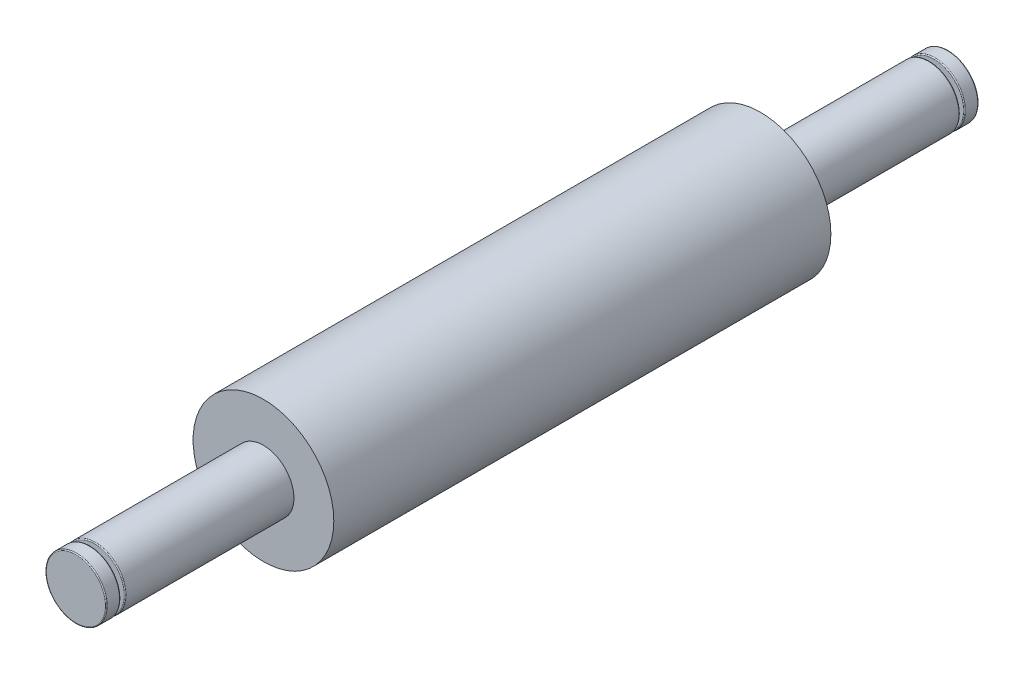
ISO-10303-21;
HEADER;
FILE_DESCRIPTION(('STEP AP214'),'2;1');
FILE_NAME('part.step','',(''),(''),'','','');
FILE_SCHEMA(('AUTOMOTIVE_DESIGN { 1 0 10303 214 1 1 1 1 }'));
ENDSEC;
DATA;
#1=APPLICATION_CONTEXT('core data for automotive mechanical design processes');
#2=APPLICATION_PROTOCOL_DEFINITION('international standard','automotive_design',2000,#1);
#3=PRODUCT_CONTEXT('',#1,'mechanical');
#4=PRODUCT('Part','Part','',(#3));
#5=PRODUCT_RELATED_PRODUCT_CATEGORY('part','',(#4));
#6=PRODUCT_DEFINITION_FORMATION('','',#4);
#7=PRODUCT_DEFINITION_CONTEXT('part definition',#1,'design');
#8=PRODUCT_DEFINITION('design','',#6,#7);
#9=PRODUCT_DEFINITION_SHAPE('','',#8);
#10=(LENGTH_UNIT() NAMED_UNIT(*) SI_UNIT(.MILLI.,.METRE.));
#11=(NAMED_UNIT(*) PLANE_ANGLE_UNIT() SI_UNIT($,.RADIAN.));
#12=(NAMED_UNIT(*) SI_UNIT($,.STERADIAN.) SOLID_ANGLE_UNIT());
#13=UNCERTAINTY_MEASURE_WITH_UNIT(LENGTH_MEASURE(1.E-05),#10,'distance_accuracy_value','');
#14=(GEOMETRIC_REPRESENTATION_CONTEXT(3) GLOBAL_UNCERTAINTY_ASSIGNED_CONTEXT((#13)) GLOBAL_UNIT_ASSIGNED_CONTEXT((#10,
#11,#12)) REPRESENTATION_CONTEXT('',''));
#15=CARTESIAN_POINT('',(0.,0.,0.));
#16=DIRECTION('',(0.,0.,1.));
#17=DIRECTION('',(1.,0.,0.));
#18=AXIS2_PLACEMENT_3D('',#15,#16,#17);
#19=CARTESIAN_POINT('',(378.123219940926,127.240995387737,-53.));
#20=DIRECTION('',(0.,0.,1.));
#21=DIRECTION('',(1.,0.,0.));
#22=AXIS2_PLACEMENT_3D('',#19,#20,#21);
#23=CYLINDRICAL_SURFACE('',#22,7.50000000000007);
#24=CARTESIAN_POINT('',(378.123219940926,127.240995387737,-53.));
#25=DIRECTION('',(0.,0.,1.));
#26=DIRECTION('',(1.,0.,0.));
#27=AXIS2_PLACEMENT_3D('',#24,#25,#26);
#28=CIRCLE('',#27,7.50000000000007);
#29=CARTESIAN_POINT('',(385.623219940926,127.240995387737,-53.));
#30=VERTEX_POINT('',#29);
#31=EDGE_CURVE('E88',#30,#30,#28,.T.);
#32=ORIENTED_EDGE('',*,*,#31,.T.);
#33=EDGE_LOOP('',(#32));
#34=FACE_BOUND('',#33,.T.);
#35=CARTESIAN_POINT('',(378.123219940926,127.240995387737,0.));
#36=DIRECTION('',(0.,0.,1.));
#37=DIRECTION('',(1.,0.,0.));
#38=AXIS2_PLACEMENT_3D('',#35,#36,#37);
#39=CIRCLE('',#38,7.50000000000007);
#40=CARTESIAN_POINT('',(385.623219940926,127.240995387737,0.));
#41=VERTEX_POINT('',#40);
#42=EDGE_CURVE('E89',#41,#41,#39,.T.);
#43=ORIENTED_EDGE('',*,*,#42,.F.);
#44=EDGE_LOOP('',(#43));
#45=FACE_BOUND('',#44,.T.);
#46=ADVANCED_FACE('F35',(#34,#45),#23,.T.);
#47=CARTESIAN_POINT('',(378.123219940926,127.240995387737,-53.));
#48=DIRECTION('',(0.,0.,1.));
#49=DIRECTION('',(1.,0.,0.));
#50=AXIS2_PLACEMENT_3D('',#47,#48,#49);
#51=PLANE('',#50);
#52=CARTESIAN_POINT('',(378.123219940926,127.240995387737,-53.));
#53=DIRECTION('',(0.,0.,1.));
#54=DIRECTION('',(1.,0.,0.));
#55=AXIS2_PLACEMENT_3D('',#52,#53,#54);
#56=CIRCLE('',#55,3.24999999999995);
#57=CARTESIAN_POINT('',(381.373219940926,127.240995387737,-53.));
#58=VERTEX_POINT('',#57);
#59=EDGE_CURVE('E83',#58,#58,#56,.T.);
#60=ORIENTED_EDGE('',*,*,#59,.T.);
#61=EDGE_LOOP('',(#60));
#62=FACE_BOUND('',#61,.T.);
#63=ORIENTED_EDGE('',*,*,#31,.F.);
#64=EDGE_LOOP('',(#63));
#65=FACE_BOUND('',#64,.T.);
#66=ADVANCED_FACE('F122',(#62,#65),#51,.F.);
#67=CARTESIAN_POINT('',(378.123219940926,127.240995387737,0.));
#68=DIRECTION('',(0.,0.,1.));
#69=DIRECTION('',(1.,0.,0.));
#70=AXIS2_PLACEMENT_3D('',#67,#68,#69);
#71=PLANE('',#70);
#72=CARTESIAN_POINT('',(378.123219940926,127.240995387737,0.));
#73=DIRECTION('',(0.,0.,1.));
#74=DIRECTION('',(1.,0.,0.));
#75=AXIS2_PLACEMENT_3D('',#72,#73,#74);
#76=CIRCLE('',#75,3.24999999999995);
#77=CARTESIAN_POINT('',(381.373219940926,127.240995387737,0.));
#78=VERTEX_POINT('',#77);
#79=EDGE_CURVE('E85',#78,#78,#76,.T.);
#80=ORIENTED_EDGE('',*,*,#79,.F.);
#81=EDGE_LOOP('',(#80));
#82=FACE_BOUND('',#81,.T.);
#83=ORIENTED_EDGE('',*,*,#42,.T.);
#84=EDGE_LOOP('',(#83));
#85=FACE_BOUND('',#84,.T.);
#86=ADVANCED_FACE('F128',(#82,#85),#71,.T.);
#87=CARTESIAN_POINT('',(378.123219940926,127.240995387737,18.));
#88=DIRECTION('',(0.,0.,1.));
#89=DIRECTION('',(1.,0.,0.));
#90=AXIS2_PLACEMENT_3D('',#87,#88,#89);
#91=PLANE('',#90);
#92=CARTESIAN_POINT('',(378.123219940926,127.240995387737,18.));
#93=DIRECTION('',(0.,0.,1.));
#94=DIRECTION('',(1.,0.,0.));
#95=AXIS2_PLACEMENT_3D('',#92,#93,#94);
#96=CIRCLE('',#95,3.14999999999996);
#97=CARTESIAN_POINT('',(381.273219940926,127.240995387737,18.));
#98=VERTEX_POINT('',#97);
#99=EDGE_CURVE('E70',#98,#98,#96,.T.);
#100=ORIENTED_EDGE('',*,*,#99,.T.);
#101=EDGE_LOOP('',(#100));
#102=FACE_BOUND('',#101,.T.);
#103=CARTESIAN_POINT('',(378.123219940926,127.240995387737,18.));
#104=DIRECTION('',(0.,0.,1.));
#105=DIRECTION('',(1.,0.,0.));
#106=AXIS2_PLACEMENT_3D('',#103,#104,#105);
#107=CIRCLE('',#106,1.74999999999998);
#108=CARTESIAN_POINT('',(379.873219940926,127.240995387737,18.));
#109=VERTEX_POINT('',#108);
#110=EDGE_CURVE('E79',#109,#109,#107,.T.);
#111=ORIENTED_EDGE('',*,*,#110,.F.);
#112=EDGE_LOOP('',(#111));
#113=FACE_BOUND('',#112,.T.);
#114=ADVANCED_FACE('F285',(#102,#113),#91,.T.);
#115=CARTESIAN_POINT('',(378.123219940926,127.240995387737,-71.));
#116=DIRECTION('',(0.,0.,1.));
#117=DIRECTION('',(1.,0.,0.));
#118=AXIS2_PLACEMENT_3D('',#115,#116,#117);
#119=CYLINDRICAL_SURFACE('',#118,3.24999999999995);
#120=CARTESIAN_POINT('',(378.123219940926,127.240995387737,17.9));
#121=DIRECTION('',(0.,0.,1.));
#122=DIRECTION('',(1.,0.,0.));
#123=AXIS2_PLACEMENT_3D('',#120,#121,#122);
#124=CIRCLE('',#123,3.24999999999995);
#125=CARTESIAN_POINT('',(381.373219940926,127.240995387737,17.9));
#126=VERTEX_POINT('',#125);
#127=EDGE_CURVE('E67',#126,#126,#124,.F.);
#128=ORIENTED_EDGE('',*,*,#127,.T.);
#129=EDGE_LOOP('',(#128));
#130=FACE_BOUND('',#129,.T.);
#131=ORIENTED_EDGE('',*,*,#79,.T.);
#132=EDGE_LOOP('',(#131));
#133=FACE_BOUND('',#132,.T.);
#134=ADVANCED_FACE('F276',(#130,#133),#119,.T.);
#135=CARTESIAN_POINT('',(378.123219940926,127.240995387737,-70.9));
#136=DIRECTION('',(0.,0.,1.));
#137=DIRECTION('',(1.,0.,0.));
#138=AXIS2_PLACEMENT_3D('',#135,#136,#137);
#139=CIRCLE('',#138,3.24999999999995);
#140=CARTESIAN_POINT('',(381.373219940926,127.240995387737,-70.9));
#141=VERTEX_POINT('',#140);
#142=EDGE_CURVE('E64',#141,#141,#139,.T.);
#143=ORIENTED_EDGE('',*,*,#142,.T.);
#144=EDGE_LOOP('',(#143));
#145=FACE_BOUND('',#144,.T.);
#146=ORIENTED_EDGE('',*,*,#59,.F.);
#147=EDGE_LOOP('',(#146));
#148=FACE_BOUND('',#147,.T.);
#149=ADVANCED_FACE('F267',(#145,#148),#119,.T.);
#150=CARTESIAN_POINT('',(378.123219940926,127.240995387737,-71.));
#151=DIRECTION('',(0.,0.,1.));
#152=DIRECTION('',(1.,0.,0.));
#153=AXIS2_PLACEMENT_3D('',#150,#151,#152);
#154=PLANE('',#153);
#155=CARTESIAN_POINT('',(378.123219940926,127.240995387737,-71.));
#156=DIRECTION('',(0.,0.,1.));
#157=DIRECTION('',(1.,0.,0.));
#158=AXIS2_PLACEMENT_3D('',#155,#156,#157);
#159=CIRCLE('',#158,3.14999999999996);
#160=CARTESIAN_POINT('',(381.273219940926,127.240995387737,-71.));
#161=VERTEX_POINT('',#160);
#162=EDGE_CURVE('E61',#161,#161,#159,.F.);
#163=ORIENTED_EDGE('',*,*,#162,.T.);
#164=EDGE_LOOP('',(#163));
#165=FACE_BOUND('',#164,.T.);
#166=CARTESIAN_POINT('',(378.123219940926,127.240995387737,-71.));
#167=DIRECTION('',(0.,0.,1.));
#168=DIRECTION('',(1.,0.,0.));
#169=AXIS2_PLACEMENT_3D('',#166,#167,#168);
#170=CIRCLE('',#169,1.74999999999998);
#171=CARTESIAN_POINT('',(379.873219940926,127.240995387737,-71.));
#172=VERTEX_POINT('',#171);
#173=EDGE_CURVE('E80',#172,#172,#170,.T.);
#174=ORIENTED_EDGE('',*,*,#173,.T.);
#175=EDGE_LOOP('',(#174));
#176=FACE_BOUND('',#175,.T.);
#177=ADVANCED_FACE('F118',(#165,#176),#154,.F.);
#178=CARTESIAN_POINT('',(378.123219940926,127.240995387737,-71.5));
#179=DIRECTION('',(0.,0.,1.));
#180=DIRECTION('',(1.,0.,0.));
#181=AXIS2_PLACEMENT_3D('',#178,#179,#180);
#182=CYLINDRICAL_SURFACE('',#181,1.74999999999998);
#183=CARTESIAN_POINT('',(378.123219940926,127.240995387737,-71.5));
#184=DIRECTION('',(0.,0.,1.));
#185=DIRECTION('',(1.,0.,0.));
#186=AXIS2_PLACEMENT_3D('',#183,#184,#185);
#187=CIRCLE('',#186,1.74999999999998);
#188=CARTESIAN_POINT('',(379.873219940926,127.240995387737,-71.5));
#189=VERTEX_POINT('',#188);
#190=EDGE_CURVE('E98',#189,#189,#187,.T.);
#191=CARTESIAN_POINT('',(379.873219940926,127.240995387737,-71.5));
#192=CARTESIAN_POINT('',(379.873219940926,127.240995387737,-71.4947916666667));
#193=CARTESIAN_POINT('',(379.873219940926,127.240995387737,-71.4895833333333));
#194=CARTESIAN_POINT('',(379.873219940926,127.240995387737,-71.4791666666667));
#195=CARTESIAN_POINT('',(379.873219940926,127.240995387737,-71.4739583333333));
#196=CARTESIAN_POINT('',(379.873219940926,127.240995387737,-71.4635416666667));
#197=CARTESIAN_POINT('',(379.873219940926,127.240995387737,-71.4583333333333));
#198=CARTESIAN_POINT('',(379.873219940926,127.240995387737,-71.4479166666667));
#199=CARTESIAN_POINT('',(379.873219940926,127.240995387737,-71.4427083333333));
#200=CARTESIAN_POINT('',(379.873219940926,127.240995387737,-71.4322916666667));
#201=CARTESIAN_POINT('',(379.873219940926,127.240995387737,-71.4270833333333));
#202=CARTESIAN_POINT('',(379.873219940926,127.240995387737,-71.4166666666667));
#203=CARTESIAN_POINT('',(379.873219940926,127.240995387737,-71.4114583333333));
#204=CARTESIAN_POINT('',(379.873219940926,127.240995387737,-71.4010416666667));
#205=CARTESIAN_POINT('',(379.873219940926,127.240995387737,-71.3958333333333));
#206=CARTESIAN_POINT('',(379.873219940926,127.240995387737,-71.3854166666667));
#207=CARTESIAN_POINT('',(379.873219940926,127.240995387737,-71.3802083333333));
#208=CARTESIAN_POINT('',(379.873219940926,127.240995387737,-71.3697916666667));
#209=CARTESIAN_POINT('',(379.873219940926,127.240995387737,-71.3645833333333));
#210=CARTESIAN_POINT('',(379.873219940926,127.240995387737,-71.3541666666667));
#211=CARTESIAN_POINT('',(379.873219940926,127.240995387737,-71.3489583333333));
#212=CARTESIAN_POINT('',(379.873219940926,127.240995387737,-71.3385416666667));
#213=CARTESIAN_POINT('',(379.873219940926,127.240995387737,-71.3333333333333));
#214=CARTESIAN_POINT('',(379.873219940926,127.240995387737,-71.3229166666667));
#215=CARTESIAN_POINT('',(379.873219940926,127.240995387737,-71.3177083333333));
#216=CARTESIAN_POINT('',(379.873219940926,127.240995387737,-71.3072916666667));
#217=CARTESIAN_POINT('',(379.873219940926,127.240995387737,-71.3020833333333));
#218=CARTESIAN_POINT('',(379.873219940926,127.240995387737,-71.2916666666667));
#219=CARTESIAN_POINT('',(379.873219940926,127.240995387737,-71.2864583333333));
#220=CARTESIAN_POINT('',(379.873219940926,127.240995387737,-71.2760416666667));
#221=CARTESIAN_POINT('',(379.873219940926,127.240995387737,-71.2708333333333));
#222=CARTESIAN_POINT('',(379.873219940926,127.240995387737,-71.2604166666667));
#223=CARTESIAN_POINT('',(379.873219940926,127.240995387737,-71.2552083333333));
#224=CARTESIAN_POINT('',(379.873219940926,127.240995387737,-71.2447916666667));
#225=CARTESIAN_POINT('',(379.873219940926,127.240995387737,-71.2395833333333));
#226=CARTESIAN_POINT('',(379.873219940926,127.240995387737,-71.2291666666667));
#227=CARTESIAN_POINT('',(379.873219940926,127.240995387737,-71.2239583333333));
#228=CARTESIAN_POINT('',(379.873219940926,127.240995387737,-71.2135416666667));
#229=CARTESIAN_POINT('',(379.873219940926,127.240995387737,-71.2083333333333));
#230=CARTESIAN_POINT('',(379.873219940926,127.240995387737,-71.1979166666667));
#231=CARTESIAN_POINT('',(379.873219940926,127.240995387737,-71.1927083333333));
#232=CARTESIAN_POINT('',(379.873219940926,127.240995387737,-71.1822916666667));
#233=CARTESIAN_POINT('',(379.873219940926,127.240995387737,-71.1770833333333));
#234=CARTESIAN_POINT('',(379.873219940926,127.240995387737,-71.1666666666667));
#235=CARTESIAN_POINT('',(379.873219940926,127.240995387737,-71.1614583333333));
#236=CARTESIAN_POINT('',(379.873219940926,127.240995387737,-71.1510416666667));
#237=CARTESIAN_POINT('',(379.873219940926,127.240995387737,-71.1458333333333));
#238=CARTESIAN_POINT('',(379.873219940926,127.240995387737,-71.1354166666667));
#239=CARTESIAN_POINT('',(379.873219940926,127.240995387737,-71.1302083333333));
#240=CARTESIAN_POINT('',(379.873219940926,127.240995387737,-71.1197916666667));
#241=CARTESIAN_POINT('',(379.873219940926,127.240995387737,-71.1145833333333));
#242=CARTESIAN_POINT('',(379.873219940926,127.240995387737,-71.1041666666667));
#243=CARTESIAN_POINT('',(379.873219940926,127.240995387737,-71.0989583333333));
#244=CARTESIAN_POINT('',(379.873219940926,127.240995387737,-71.0885416666667));
#245=CARTESIAN_POINT('',(379.873219940926,127.240995387737,-71.0833333333333));
#246=CARTESIAN_POINT('',(379.873219940926,127.240995387737,-71.0729166666667));
#247=CARTESIAN_POINT('',(379.873219940926,127.240995387737,-71.0677083333333));
#248=CARTESIAN_POINT('',(379.873219940926,127.240995387737,-71.0572916666667));
#249=CARTESIAN_POINT('',(379.873219940926,127.240995387737,-71.0520833333333));
#250=CARTESIAN_POINT('',(379.873219940926,127.240995387737,-71.0416666666667));
#251=CARTESIAN_POINT('',(379.873219940926,127.240995387737,-71.0364583333333));
#252=CARTESIAN_POINT('',(379.873219940926,127.240995387737,-71.0260416666667));
#253=CARTESIAN_POINT('',(379.873219940926,127.240995387737,-71.0208333333333));
#254=CARTESIAN_POINT('',(379.873219940926,127.240995387737,-71.0104166666667));
#255=CARTESIAN_POINT('',(379.873219940926,127.240995387737,-71.0052083333333));
#256=CARTESIAN_POINT('',(379.873219940926,127.240995387737,-71.));
#257=B_SPLINE_CURVE_WITH_KNOTS('',3,(#191,#192,#193,#194,#195,#196,#197,#198,#199,#200,#201,
#202,#203,#204,#205,#206,#207,#208,#209,#210,#211,#212,#213,#214,#215,#216,#217,#218,#219,#220,
#221,#222,#223,#224,#225,#226,#227,#228,#229,#230,#231,#232,#233,#234,#235,#236,#237,#238,#239,
#240,#241,#242,#243,#244,#245,#246,#247,#248,#249,#250,#251,#252,#253,#254,#255,#256),
.UNSPECIFIED.,.F.,.F.,(4,2,2,2,2,2,2,2,2,2,2,2,2,2,2,2,2,2,2,2,2,2,2,2,2,2,2,2,2,2,2,2,4),(0.,
0.0156250000000052,0.0312500000000104,0.0468750000000018,0.062500000000007,0.0781250000000122,
0.0937500000000036,0.109375000000009,0.125000000000014,0.140625000000005,0.156250000000011,
0.171875000000002,0.187500000000007,0.203125000000012,0.218750000000004,0.234375000000009,
0.250000000000014,0.265625000000005,0.281250000000011,0.296875000000002,0.312500000000007,
0.328125000000012,0.343750000000004,0.359375000000009,0.375000000000014,0.390625000000006,
0.406250000000011,0.421875000000002,0.437500000000007,0.453125000000013,0.468750000000004,
0.484375000000009,0.500000000000014),.UNSPECIFIED.);
#258=EDGE_CURVE('BSEAM109',#189,#172,#257,.T.);
#259=ORIENTED_EDGE('',*,*,#190,.T.);
#260=ORIENTED_EDGE('',*,*,#173,.F.);
#261=ORIENTED_EDGE('',*,*,#258,.T.);
#262=ORIENTED_EDGE('',*,*,#258,.F.);
#263=EDGE_LOOP('',(#259,#261,#260,#262));
#264=FACE_BOUND('',#263,.T.);
#265=ADVANCED_FACE('F109',(#264),#182,.T.);
#266=CARTESIAN_POINT('',(378.123219940926,127.240995387737,18.5));
#267=DIRECTION('',(0.,0.,1.));
#268=DIRECTION('',(1.,0.,0.));
#269=AXIS2_PLACEMENT_3D('',#266,#267,#268);
#270=CIRCLE('',#269,1.74999999999998);
#271=CARTESIAN_POINT('',(379.873219940926,127.240995387737,18.5));
#272=VERTEX_POINT('',#271);
#273=EDGE_CURVE('E84',#272,#272,#270,.T.);
#274=CARTESIAN_POINT('',(379.873219940926,127.240995387737,18.));
#275=CARTESIAN_POINT('',(379.873219940926,127.240995387737,18.0052083333333));
#276=CARTESIAN_POINT('',(379.873219940926,127.240995387737,18.0104166666667));
#277=CARTESIAN_POINT('',(379.873219940926,127.240995387737,18.0208333333333));
#278=CARTESIAN_POINT('',(379.873219940926,127.240995387737,18.0260416666667));
#279=CARTESIAN_POINT('',(379.873219940926,127.240995387737,18.0364583333333));
#280=CARTESIAN_POINT('',(379.873219940926,127.240995387737,18.0416666666667));
#281=CARTESIAN_POINT('',(379.873219940926,127.240995387737,18.0520833333333));
#282=CARTESIAN_POINT('',(379.873219940926,127.240995387737,18.0572916666667));
#283=CARTESIAN_POINT('',(379.873219940926,127.240995387737,18.0677083333333));
#284=CARTESIAN_POINT('',(379.873219940926,127.240995387737,18.0729166666667));
#285=CARTESIAN_POINT('',(379.873219940926,127.240995387737,18.0833333333333));
#286=CARTESIAN_POINT('',(379.873219940926,127.240995387737,18.0885416666667));
#287=CARTESIAN_POINT('',(379.873219940926,127.240995387737,18.0989583333333));
#288=CARTESIAN_POINT('',(379.873219940926,127.240995387737,18.1041666666667));
#289=CARTESIAN_POINT('',(379.873219940926,127.240995387737,18.1145833333333));
#290=CARTESIAN_POINT('',(379.873219940926,127.240995387737,18.1197916666667));
#291=CARTESIAN_POINT('',(379.873219940926,127.240995387737,18.1302083333333));
#292=CARTESIAN_POINT('',(379.873219940926,127.240995387737,18.1354166666667));
#293=CARTESIAN_POINT('',(379.873219940926,127.240995387737,18.1458333333333));
#294=CARTESIAN_POINT('',(379.873219940926,127.240995387737,18.1510416666667));
#295=CARTESIAN_POINT('',(379.873219940926,127.240995387737,18.1614583333333));
#296=CARTESIAN_POINT('',(379.873219940926,127.240995387737,18.1666666666667));
#297=CARTESIAN_POINT('',(379.873219940926,127.240995387737,18.1770833333333));
#298=CARTESIAN_POINT('',(379.873219940926,127.240995387737,18.1822916666667));
#299=CARTESIAN_POINT('',(379.873219940926,127.240995387737,18.1927083333333));
#300=CARTESIAN_POINT('',(379.873219940926,127.240995387737,18.1979166666667));
#301=CARTESIAN_POINT('',(379.873219940926,127.240995387737,18.2083333333333));
#302=CARTESIAN_POINT('',(379.873219940926,127.240995387737,18.2135416666667));
#303=CARTESIAN_POINT('',(379.873219940926,127.240995387737,18.2239583333333));
#304=CARTESIAN_POINT('',(379.873219940926,127.240995387737,18.2291666666667));
#305=CARTESIAN_POINT('',(379.873219940926,127.240995387737,18.2395833333333));
#306=CARTESIAN_POINT('',(379.873219940926,127.240995387737,18.2447916666667));
#307=CARTESIAN_POINT('',(379.873219940926,127.240995387737,18.2552083333333));
#308=CARTESIAN_POINT('',(379.873219940926,127.240995387737,18.2604166666667));
#309=CARTESIAN_POINT('',(379.873219940926,127.240995387737,18.2708333333333));
#310=CARTESIAN_POINT('',(379.873219940926,127.240995387737,18.2760416666667));
#311=CARTESIAN_POINT('',(379.873219940926,127.240995387737,18.2864583333333));
#312=CARTESIAN_POINT('',(379.873219940926,127.240995387737,18.2916666666667));
#313=CARTESIAN_POINT('',(379.873219940926,127.240995387737,18.3020833333333));
#314=CARTESIAN_POINT('',(379.873219940926,127.240995387737,18.3072916666667));
#315=CARTESIAN_POINT('',(379.873219940926,127.240995387737,18.3177083333333));
#316=CARTESIAN_POINT('',(379.873219940926,127.240995387737,18.3229166666667));
#317=CARTESIAN_POINT('',(379.873219940926,127.240995387737,18.3333333333333));
#318=CARTESIAN_POINT('',(379.873219940926,127.240995387737,18.3385416666667));
#319=CARTESIAN_POINT('',(379.873219940926,127.240995387737,18.3489583333333));
#320=CARTESIAN_POINT('',(379.873219940926,127.240995387737,18.3541666666667));
#321=CARTESIAN_POINT('',(379.873219940926,127.240995387737,18.3645833333333));
#322=CARTESIAN_POINT('',(379.873219940926,127.240995387737,18.3697916666667));
#323=CARTESIAN_POINT('',(379.873219940926,127.240995387737,18.3802083333333));
#324=CARTESIAN_POINT('',(379.873219940926,127.240995387737,18.3854166666667));
#325=CARTESIAN_POINT('',(379.873219940926,127.240995387737,18.3958333333333));
#326=CARTESIAN_POINT('',(379.873219940926,127.240995387737,18.4010416666667));
#327=CARTESIAN_POINT('',(379.873219940926,127.240995387737,18.4114583333333));
#328=CARTESIAN_POINT('',(379.873219940926,127.240995387737,18.4166666666667));
#329=CARTESIAN_POINT('',(379.873219940926,127.240995387737,18.4270833333333));
#330=CARTESIAN_POINT('',(379.873219940926,127.240995387737,18.4322916666667));
#331=CARTESIAN_POINT('',(379.873219940926,127.240995387737,18.4427083333333));
#332=CARTESIAN_POINT('',(379.873219940926,127.240995387737,18.4479166666667));
#333=CARTESIAN_POINT('',(379.873219940926,127.240995387737,18.4583333333333));
#334=CARTESIAN_POINT('',(379.873219940926,127.240995387737,18.4635416666667));
#335=CARTESIAN_POINT('',(379.873219940926,127.240995387737,18.4739583333333));
#336=CARTESIAN_POINT('',(379.873219940926,127.240995387737,18.4791666666667));
#337=CARTESIAN_POINT('',(379.873219940926,127.240995387737,18.4895833333333));
#338=CARTESIAN_POINT('',(379.873219940926,127.240995387737,18.4947916666667));
#339=CARTESIAN_POINT('',(379.873219940926,127.240995387737,18.5));
#340=B_SPLINE_CURVE_WITH_KNOTS('',3,(#274,#275,#276,#277,#278,#279,#280,#281,#282,#283,#284,
#285,#286,#287,#288,#289,#290,#291,#292,#293,#294,#295,#296,#297,#298,#299,#300,#301,#302,#303,
#304,#305,#306,#307,#308,#309,#310,#311,#312,#313,#314,#315,#316,#317,#318,#319,#320,#321,#322,
#323,#324,#325,#326,#327,#328,#329,#330,#331,#332,#333,#334,#335,#336,#337,#338,#339),
.UNSPECIFIED.,.F.,.F.,(4,2,2,2,2,2,2,2,2,2,2,2,2,2,2,2,2,2,2,2,2,2,2,2,2,2,2,2,2,2,2,2,4),(0.,
0.0156250000000052,0.0312499999999966,0.0468750000000018,0.0624999999999931,0.0781249999999983,
0.0937500000000036,0.109374999999995,0.125,0.140625000000005,0.156249999999997,
0.171875000000002,0.187500000000007,0.203124999999998,0.218750000000004,0.234374999999995,0.25,
0.265625000000005,0.281249999999997,0.296875000000002,0.312499999999993,0.328124999999999,
0.343750000000004,0.359374999999995,0.375,0.390625000000006,0.406249999999997,0.421875000000002,
0.437500000000007,0.453124999999999,0.468750000000004,0.484374999999995,0.5),.UNSPECIFIED.);
#341=EDGE_CURVE('BSEAM106',#109,#272,#340,.T.);
#342=ORIENTED_EDGE('',*,*,#110,.T.);
#343=ORIENTED_EDGE('',*,*,#273,.F.);
#344=ORIENTED_EDGE('',*,*,#341,.T.);
#345=ORIENTED_EDGE('',*,*,#341,.F.);
#346=EDGE_LOOP('',(#342,#344,#343,#345));
#347=FACE_BOUND('',#346,.T.);
#348=ADVANCED_FACE('F106',(#347),#182,.T.);
#349=CARTESIAN_POINT('',(378.123219940926,127.240995387737,20.));
#350=DIRECTION('',(0.,0.,-1.));
#351=DIRECTION('',(-1.,0.,0.));
#352=AXIS2_PLACEMENT_3D('',#349,#350,#351);
#353=CYLINDRICAL_SURFACE('',#352,3.24999999999995);
#354=CARTESIAN_POINT('',(378.123219940926,127.240995387737,19.9));
#355=DIRECTION('',(0.,0.,1.));
#356=DIRECTION('',(1.,0.,0.));
#357=AXIS2_PLACEMENT_3D('',#354,#355,#356);
#358=CIRCLE('',#357,3.24999999999995);
#359=CARTESIAN_POINT('',(381.373219940926,127.240995387737,19.9));
#360=VERTEX_POINT('',#359);
#361=EDGE_CURVE('E10',#360,#360,#358,.F.);
#362=ORIENTED_EDGE('',*,*,#361,.T.);
#363=EDGE_LOOP('',(#362));
#364=FACE_BOUND('',#363,.T.);
#365=CARTESIAN_POINT('',(378.123219940926,127.240995387737,18.6));
#366=DIRECTION('',(0.,0.,1.));
#367=DIRECTION('',(1.,0.,0.));
#368=AXIS2_PLACEMENT_3D('',#365,#366,#367);
#369=CIRCLE('',#368,3.24999999999995);
#370=CARTESIAN_POINT('',(381.373219940926,127.240995387737,18.6));
#371=VERTEX_POINT('',#370);
#372=EDGE_CURVE('E76',#371,#371,#369,.T.);
#373=ORIENTED_EDGE('',*,*,#372,.T.);
#374=EDGE_LOOP('',(#373));
#375=FACE_BOUND('',#374,.T.);
#376=ADVANCED_FACE('F108',(#364,#375),#353,.T.);
#377=CARTESIAN_POINT('',(378.123219940926,127.240995387737,20.));
#378=DIRECTION('',(0.,0.,1.));
#379=DIRECTION('',(1.,0.,0.));
#380=AXIS2_PLACEMENT_3D('',#377,#378,#379);
#381=PLANE('',#380);
#382=CARTESIAN_POINT('',(378.123219940926,127.240995387737,20.));
#383=DIRECTION('',(0.,0.,1.));
#384=DIRECTION('',(1.,0.,0.));
#385=AXIS2_PLACEMENT_3D('',#382,#383,#384);
#386=CIRCLE('',#385,3.14999999999996);
#387=CARTESIAN_POINT('',(381.273219940926,127.240995387737,20.));
#388=VERTEX_POINT('',#387);
#389=EDGE_CURVE('E42',#388,#388,#386,.T.);
#390=ORIENTED_EDGE('',*,*,#389,.T.);
#391=EDGE_LOOP('',(#390));
#392=FACE_BOUND('',#391,.T.);
#393=ADVANCED_FACE('F116',(#392),#381,.T.);
#394=CARTESIAN_POINT('',(378.123219940926,127.240995387737,18.5));
#395=DIRECTION('',(0.,0.,1.));
#396=DIRECTION('',(1.,0.,0.));
#397=AXIS2_PLACEMENT_3D('',#394,#395,#396);
#398=PLANE('',#397);
#399=CARTESIAN_POINT('',(378.123219940926,127.240995387737,18.5));
#400=DIRECTION('',(0.,0.,1.));
#401=DIRECTION('',(1.,0.,0.));
#402=AXIS2_PLACEMENT_3D('',#399,#400,#401);
#403=CIRCLE('',#402,3.14999999999996);
#404=CARTESIAN_POINT('',(381.273219940926,127.240995387737,18.5));
#405=VERTEX_POINT('',#404);
#406=EDGE_CURVE('E73',#405,#405,#403,.F.);
#407=ORIENTED_EDGE('',*,*,#406,.T.);
#408=EDGE_LOOP('',(#407));
#409=FACE_BOUND('',#408,.T.);
#410=ORIENTED_EDGE('',*,*,#273,.T.);
#411=EDGE_LOOP('',(#410));
#412=FACE_BOUND('',#411,.T.);
#413=ADVANCED_FACE('F104',(#409,#412),#398,.F.);
#414=CARTESIAN_POINT('',(378.123219940926,127.240995387737,-73.));
#415=DIRECTION('',(0.,0.,1.));
#416=DIRECTION('',(1.,0.,0.));
#417=AXIS2_PLACEMENT_3D('',#414,#415,#416);
#418=CYLINDRICAL_SURFACE('',#417,3.24999999999995);
#419=CARTESIAN_POINT('',(378.123219940926,127.240995387737,-72.9));
#420=DIRECTION('',(0.,0.,-1.));
#421=DIRECTION('',(-1.,0.,0.));
#422=AXIS2_PLACEMENT_3D('',#419,#420,#421);
#423=CIRCLE('',#422,3.24999999999995);
#424=CARTESIAN_POINT('',(374.873219940926,127.240995387737,-72.9));
#425=VERTEX_POINT('',#424);
#426=EDGE_CURVE('E46',#425,#425,#423,.F.);
#427=ORIENTED_EDGE('',*,*,#426,.T.);
#428=EDGE_LOOP('',(#427));
#429=FACE_BOUND('',#428,.T.);
#430=CARTESIAN_POINT('',(378.123219940926,127.240995387737,-71.6));
#431=DIRECTION('',(0.,0.,-1.));
#432=DIRECTION('',(-1.,0.,0.));
#433=AXIS2_PLACEMENT_3D('',#430,#431,#432);
#434=CIRCLE('',#433,3.24999999999995);
#435=CARTESIAN_POINT('',(374.873219940926,127.240995387737,-71.6));
#436=VERTEX_POINT('',#435);
#437=EDGE_CURVE('E58',#436,#436,#434,.T.);
#438=ORIENTED_EDGE('',*,*,#437,.T.);
#439=EDGE_LOOP('',(#438));
#440=FACE_BOUND('',#439,.T.);
#441=ADVANCED_FACE('F163',(#429,#440),#418,.T.);
#442=CARTESIAN_POINT('',(378.123219940926,127.240995387737,-73.));
#443=DIRECTION('',(0.,0.,-1.));
#444=DIRECTION('',(-1.,0.,0.));
#445=AXIS2_PLACEMENT_3D('',#442,#443,#444);
#446=PLANE('',#445);
#447=CARTESIAN_POINT('',(378.123219940926,127.240995387737,-73.));
#448=DIRECTION('',(0.,0.,-1.));
#449=DIRECTION('',(-1.,0.,0.));
#450=AXIS2_PLACEMENT_3D('',#447,#448,#449);
#451=CIRCLE('',#450,3.14999999999996);
#452=CARTESIAN_POINT('',(374.973219940926,127.240995387737,-73.));
#453=VERTEX_POINT('',#452);
#454=EDGE_CURVE('E50',#453,#453,#451,.T.);
#455=ORIENTED_EDGE('',*,*,#454,.T.);
#456=EDGE_LOOP('',(#455));
#457=FACE_BOUND('',#456,.T.);
#458=ADVANCED_FACE('F161',(#457),#446,.T.);
#459=CARTESIAN_POINT('',(378.123219940926,127.240995387737,-71.5));
#460=DIRECTION('',(0.,0.,-1.));
#461=DIRECTION('',(-1.,0.,0.));
#462=AXIS2_PLACEMENT_3D('',#459,#460,#461);
#463=PLANE('',#462);
#464=CARTESIAN_POINT('',(378.123219940926,127.240995387737,-71.5));
#465=DIRECTION('',(0.,0.,-1.));
#466=DIRECTION('',(-1.,0.,0.));
#467=AXIS2_PLACEMENT_3D('',#464,#465,#466);
#468=CIRCLE('',#467,3.14999999999996);
#469=CARTESIAN_POINT('',(374.973219940926,127.240995387737,-71.5));
#470=VERTEX_POINT('',#469);
#471=EDGE_CURVE('E55',#470,#470,#468,.F.);
#472=ORIENTED_EDGE('',*,*,#471,.T.);
#473=EDGE_LOOP('',(#472));
#474=FACE_BOUND('',#473,.T.);
#475=ORIENTED_EDGE('',*,*,#190,.F.);
#476=EDGE_LOOP('',(#475));
#477=FACE_BOUND('',#476,.T.);
#478=ADVANCED_FACE('F138',(#474,#477),#463,.F.);
#479=CARTESIAN_POINT('',(378.123219940926,127.240995387737,18.6));
#480=DIRECTION('',(0.,0.,1.));
#481=DIRECTION('',(1.,0.,0.));
#482=AXIS2_PLACEMENT_3D('',#479,#480,#481);
#483=TOROIDAL_SURFACE('',#482,3.14999999999996,0.1);
#484=ORIENTED_EDGE('',*,*,#406,.F.);
#485=EDGE_LOOP('',(#484));
#486=FACE_BOUND('',#485,.T.);
#487=ORIENTED_EDGE('',*,*,#372,.F.);
#488=EDGE_LOOP('',(#487));
#489=FACE_BOUND('',#488,.T.);
#490=ADVANCED_FACE('F134',(#486,#489),#483,.T.);
#491=CARTESIAN_POINT('',(378.123219940926,127.240995387737,17.9));
#492=DIRECTION('',(0.,0.,1.));
#493=DIRECTION('',(1.,0.,0.));
#494=AXIS2_PLACEMENT_3D('',#491,#492,#493);
#495=TOROIDAL_SURFACE('',#494,3.14999999999996,0.1);
#496=ORIENTED_EDGE('',*,*,#127,.F.);
#497=EDGE_LOOP('',(#496));
#498=FACE_BOUND('',#497,.T.);
#499=ORIENTED_EDGE('',*,*,#99,.F.);
#500=EDGE_LOOP('',(#499));
#501=FACE_BOUND('',#500,.T.);
#502=ADVANCED_FACE('F137',(#498,#501),#495,.T.);
#503=CARTESIAN_POINT('',(378.123219940926,127.240995387737,-70.9));
#504=DIRECTION('',(0.,0.,1.));
#505=DIRECTION('',(1.,0.,0.));
#506=AXIS2_PLACEMENT_3D('',#503,#504,#505);
#507=TOROIDAL_SURFACE('',#506,3.14999999999996,0.1);
#508=ORIENTED_EDGE('',*,*,#162,.F.);
#509=EDGE_LOOP('',(#508));
#510=FACE_BOUND('',#509,.T.);
#511=ORIENTED_EDGE('',*,*,#142,.F.);
#512=EDGE_LOOP('',(#511));
#513=FACE_BOUND('',#512,.T.);
#514=ADVANCED_FACE('F142',(#510,#513),#507,.T.);
#515=CARTESIAN_POINT('',(378.123219940926,127.240995387737,-71.6));
#516=DIRECTION('',(0.,0.,-1.));
#517=DIRECTION('',(-1.,0.,0.));
#518=AXIS2_PLACEMENT_3D('',#515,#516,#517);
#519=TOROIDAL_SURFACE('',#518,3.14999999999996,0.1);
#520=ORIENTED_EDGE('',*,*,#471,.F.);
#521=EDGE_LOOP('',(#520));
#522=FACE_BOUND('',#521,.T.);
#523=ORIENTED_EDGE('',*,*,#437,.F.);
#524=EDGE_LOOP('',(#523));
#525=FACE_BOUND('',#524,.T.);
#526=ADVANCED_FACE('F146',(#522,#525),#519,.T.);
#527=CARTESIAN_POINT('',(378.123219940926,127.240995387737,-72.9));
#528=DIRECTION('',(0.,0.,-1.));
#529=DIRECTION('',(-1.,0.,0.));
#530=AXIS2_PLACEMENT_3D('',#527,#528,#529);
#531=TOROIDAL_SURFACE('',#530,3.14999999999996,0.1);
#532=ORIENTED_EDGE('',*,*,#426,.F.);
#533=EDGE_LOOP('',(#532));
#534=FACE_BOUND('',#533,.T.);
#535=ORIENTED_EDGE('',*,*,#454,.F.);
#536=EDGE_LOOP('',(#535));
#537=FACE_BOUND('',#536,.T.);
#538=ADVANCED_FACE('F149',(#534,#537),#531,.T.);
#539=CARTESIAN_POINT('',(378.123219940926,127.240995387737,19.9));
#540=DIRECTION('',(0.,0.,1.));
#541=DIRECTION('',(1.,0.,0.));
#542=AXIS2_PLACEMENT_3D('',#539,#540,#541);
#543=TOROIDAL_SURFACE('',#542,3.14999999999996,0.1);
#544=ORIENTED_EDGE('',*,*,#361,.F.);
#545=EDGE_LOOP('',(#544));
#546=FACE_BOUND('',#545,.T.);
#547=ORIENTED_EDGE('',*,*,#389,.F.);
#548=EDGE_LOOP('',(#547));
#549=FACE_BOUND('',#548,.T.);
#550=ADVANCED_FACE('F37',(#546,#549),#543,.T.);
#551=CLOSED_SHELL('',(#46,#66,#86,#114,#134,#149,#177,#265,#348,#376,#393,#413,#441,#458,#478,
#490,#502,#514,#526,#538,#550));
#552=MANIFOLD_SOLID_BREP('B2',#551);
#553=ADVANCED_BREP_SHAPE_REPRESENTATION('',(#18,#552),#14);
#554=SHAPE_DEFINITION_REPRESENTATION(#9,#553);
ENDSEC;
END-ISO-10303-21;
